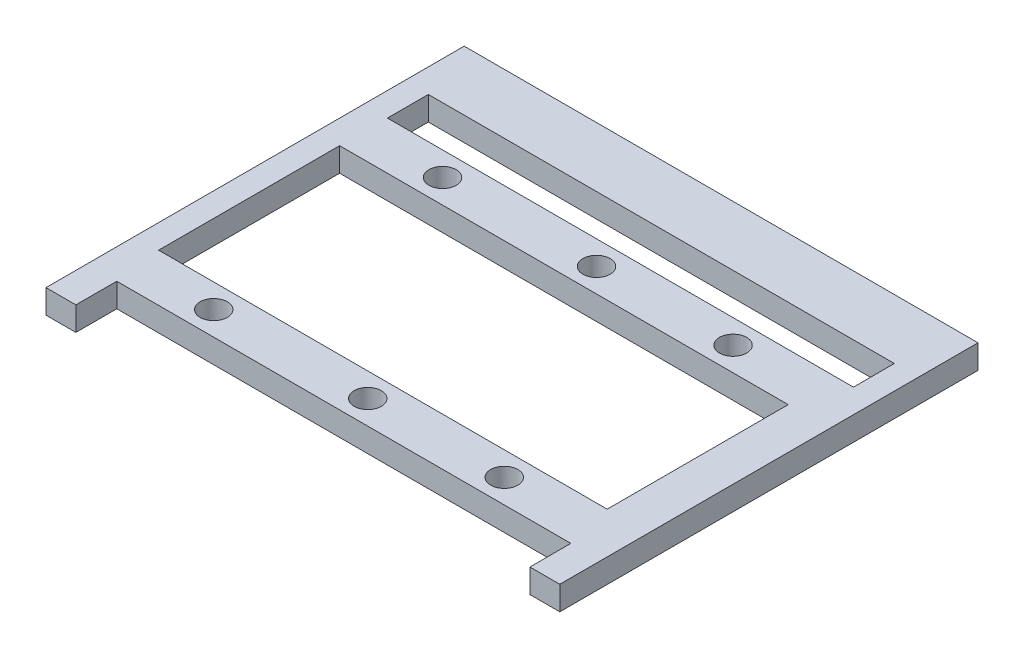
ISO-10303-21;
HEADER;
FILE_DESCRIPTION(('STEP AP214'),'2;1');
FILE_NAME('part.step','',(''),(''),'','','');
FILE_SCHEMA(('AUTOMOTIVE_DESIGN { 1 0 10303 214 1 1 1 1 }'));
ENDSEC;
DATA;
#1=APPLICATION_CONTEXT('core data for automotive mechanical design processes');
#2=APPLICATION_PROTOCOL_DEFINITION('international standard','automotive_design',2000,#1);
#3=PRODUCT_CONTEXT('',#1,'mechanical');
#4=PRODUCT('Part','Part','',(#3));
#5=PRODUCT_RELATED_PRODUCT_CATEGORY('part','',(#4));
#6=PRODUCT_DEFINITION_FORMATION('','',#4);
#7=PRODUCT_DEFINITION_CONTEXT('part definition',#1,'design');
#8=PRODUCT_DEFINITION('design','',#6,#7);
#9=PRODUCT_DEFINITION_SHAPE('','',#8);
#10=(LENGTH_UNIT() NAMED_UNIT(*) SI_UNIT(.MILLI.,.METRE.));
#11=(NAMED_UNIT(*) PLANE_ANGLE_UNIT() SI_UNIT($,.RADIAN.));
#12=(NAMED_UNIT(*) SI_UNIT($,.STERADIAN.) SOLID_ANGLE_UNIT());
#13=UNCERTAINTY_MEASURE_WITH_UNIT(LENGTH_MEASURE(1.E-05),#10,'distance_accuracy_value','');
#14=(GEOMETRIC_REPRESENTATION_CONTEXT(3) GLOBAL_UNCERTAINTY_ASSIGNED_CONTEXT((#13)) GLOBAL_UNIT_ASSIGNED_CONTEXT((#10,
#11,#12)) REPRESENTATION_CONTEXT('',''));
#15=CARTESIAN_POINT('',(0.,0.,0.));
#16=DIRECTION('',(0.,0.,1.));
#17=DIRECTION('',(1.,0.,0.));
#18=AXIS2_PLACEMENT_3D('',#15,#16,#17);
#19=CARTESIAN_POINT('',(0.,4.,0.));
#20=DIRECTION('',(0.,-1.,0.));
#21=DIRECTION('',(0.,0.,-1.));
#22=AXIS2_PLACEMENT_3D('',#19,#20,#21);
#23=PLANE('',#22);
#24=DIRECTION('',(1.,0.,0.));
#25=VECTOR('',#24,1.);
#26=CARTESIAN_POINT('',(43.,4.,-30.));
#27=LINE('',#26,#25);
#28=CARTESIAN_POINT('',(-39.,4.,-30.));
#29=VERTEX_POINT('',#28);
#30=CARTESIAN_POINT('',(39.,4.,-30.));
#31=VERTEX_POINT('',#30);
#32=EDGE_CURVE('E190',#29,#31,#27,.T.);
#33=ORIENTED_EDGE('',*,*,#32,.T.);
#34=DIRECTION('',(0.,0.,1.));
#35=VECTOR('',#34,1.);
#36=CARTESIAN_POINT('',(39.,4.,-30.));
#37=LINE('',#36,#35);
#38=CARTESIAN_POINT('',(39.,4.,-23.15));
#39=VERTEX_POINT('',#38);
#40=EDGE_CURVE('E297',#31,#39,#37,.T.);
#41=ORIENTED_EDGE('',*,*,#40,.T.);
#42=DIRECTION('',(-1.,0.,0.));
#43=VECTOR('',#42,1.);
#44=CARTESIAN_POINT('',(-39.,4.,-23.15));
#45=LINE('',#44,#43);
#46=CARTESIAN_POINT('',(-39.,4.,-23.15));
#47=VERTEX_POINT('',#46);
#48=EDGE_CURVE('E300',#39,#47,#45,.T.);
#49=ORIENTED_EDGE('',*,*,#48,.T.);
#50=DIRECTION('',(0.,0.,-1.));
#51=VECTOR('',#50,1.);
#52=CARTESIAN_POINT('',(-39.,4.,-23.15));
#53=LINE('',#52,#51);
#54=EDGE_CURVE('E303',#47,#29,#53,.T.);
#55=ORIENTED_EDGE('',*,*,#54,.T.);
#56=EDGE_LOOP('',(#33,#41,#49,#55));
#57=FACE_BOUND('',#56,.T.);
#58=CARTESIAN_POINT('',(-25.775,4.,19.15));
#59=DIRECTION('',(0.,1.,0.));
#60=DIRECTION('',(0.,0.,-1.));
#61=AXIS2_PLACEMENT_3D('',#58,#59,#60);
#62=CIRCLE('',#61,2.275);
#63=CARTESIAN_POINT('',(-25.775,4.,16.875));
#64=VERTEX_POINT('',#63);
#65=EDGE_CURVE('E242',#64,#64,#62,.T.);
#66=ORIENTED_EDGE('',*,*,#65,.F.);
#67=EDGE_LOOP('',(#66));
#68=FACE_BOUND('',#67,.T.);
#69=CARTESIAN_POINT('',(0.,4.,19.15));
#70=DIRECTION('',(0.,1.,0.));
#71=DIRECTION('',(0.,0.,-1.));
#72=AXIS2_PLACEMENT_3D('',#69,#70,#71);
#73=CIRCLE('',#72,2.275);
#74=CARTESIAN_POINT('',(0.,4.,16.875));
#75=VERTEX_POINT('',#74);
#76=EDGE_CURVE('E250',#75,#75,#73,.T.);
#77=ORIENTED_EDGE('',*,*,#76,.F.);
#78=EDGE_LOOP('',(#77));
#79=FACE_BOUND('',#78,.T.);
#80=CARTESIAN_POINT('',(22.8542541507849,4.,19.15));
#81=DIRECTION('',(0.,1.,0.));
#82=DIRECTION('',(0.,0.,-1.));
#83=AXIS2_PLACEMENT_3D('',#80,#81,#82);
#84=CIRCLE('',#83,2.275);
#85=CARTESIAN_POINT('',(22.8542541507849,4.,16.875));
#86=VERTEX_POINT('',#85);
#87=EDGE_CURVE('E258',#86,#86,#84,.T.);
#88=ORIENTED_EDGE('',*,*,#87,.F.);
#89=EDGE_LOOP('',(#88));
#90=FACE_BOUND('',#89,.T.);
#91=CARTESIAN_POINT('',(0.,4.,-19.15));
#92=DIRECTION('',(0.,1.,0.));
#93=DIRECTION('',(0.,0.,1.));
#94=AXIS2_PLACEMENT_3D('',#91,#92,#93);
#95=CIRCLE('',#94,2.275);
#96=CARTESIAN_POINT('',(0.,4.,-16.875));
#97=VERTEX_POINT('',#96);
#98=EDGE_CURVE('E266',#97,#97,#95,.T.);
#99=ORIENTED_EDGE('',*,*,#98,.F.);
#100=EDGE_LOOP('',(#99));
#101=FACE_BOUND('',#100,.T.);
#102=CARTESIAN_POINT('',(22.8542541507849,4.,-19.15));
#103=DIRECTION('',(0.,1.,0.));
#104=DIRECTION('',(0.,0.,1.));
#105=AXIS2_PLACEMENT_3D('',#102,#103,#104);
#106=CIRCLE('',#105,2.275);
#107=CARTESIAN_POINT('',(22.8542541507849,4.,-16.875));
#108=VERTEX_POINT('',#107);
#109=EDGE_CURVE('E274',#108,#108,#106,.T.);
#110=ORIENTED_EDGE('',*,*,#109,.F.);
#111=EDGE_LOOP('',(#110));
#112=FACE_BOUND('',#111,.T.);
#113=CARTESIAN_POINT('',(-25.775,4.,-19.15));
#114=DIRECTION('',(0.,1.,0.));
#115=DIRECTION('',(0.,0.,1.));
#116=AXIS2_PLACEMENT_3D('',#113,#114,#115);
#117=CIRCLE('',#116,2.275);
#118=CARTESIAN_POINT('',(-25.775,4.,-16.875));
#119=VERTEX_POINT('',#118);
#120=EDGE_CURVE('E282',#119,#119,#117,.T.);
#121=ORIENTED_EDGE('',*,*,#120,.F.);
#122=EDGE_LOOP('',(#121));
#123=FACE_BOUND('',#122,.T.);
#124=DIRECTION('',(1.,0.,0.));
#125=VECTOR('',#124,1.);
#126=CARTESIAN_POINT('',(38.,4.,30.));
#127=LINE('',#126,#125);
#128=CARTESIAN_POINT('',(38.,4.,30.));
#129=VERTEX_POINT('',#128);
#130=CARTESIAN_POINT('',(43.,4.,30.));
#131=VERTEX_POINT('',#130);
#132=EDGE_CURVE('E289',#129,#131,#127,.T.);
#133=ORIENTED_EDGE('',*,*,#132,.T.);
#134=DIRECTION('',(0.,0.,-1.));
#135=VECTOR('',#134,1.);
#136=CARTESIAN_POINT('',(43.,4.,-30.));
#137=LINE('',#136,#135);
#138=CARTESIAN_POINT('',(43.,4.,-40.));
#139=VERTEX_POINT('',#138);
#140=EDGE_CURVE('E293',#131,#139,#137,.T.);
#141=ORIENTED_EDGE('',*,*,#140,.T.);
#142=DIRECTION('',(1.,0.,0.));
#143=VECTOR('',#142,1.);
#144=CARTESIAN_POINT('',(43.,4.,-40.));
#145=LINE('',#144,#143);
#146=CARTESIAN_POINT('',(-43.,4.,-40.));
#147=VERTEX_POINT('',#146);
#148=EDGE_CURVE('E188',#147,#139,#145,.T.);
#149=ORIENTED_EDGE('',*,*,#148,.F.);
#150=DIRECTION('',(0.,0.,1.));
#151=VECTOR('',#150,1.);
#152=CARTESIAN_POINT('',(-43.,4.,-30.));
#153=LINE('',#152,#151);
#154=CARTESIAN_POINT('',(-43.,4.,30.));
#155=VERTEX_POINT('',#154);
#156=EDGE_CURVE('E307',#147,#155,#153,.T.);
#157=ORIENTED_EDGE('',*,*,#156,.T.);
#158=DIRECTION('',(1.,0.,0.));
#159=VECTOR('',#158,1.);
#160=CARTESIAN_POINT('',(-43.,4.,30.));
#161=LINE('',#160,#159);
#162=CARTESIAN_POINT('',(-38.,4.,30.));
#163=VERTEX_POINT('',#162);
#164=EDGE_CURVE('E310',#155,#163,#161,.T.);
#165=ORIENTED_EDGE('',*,*,#164,.T.);
#166=DIRECTION('',(0.,0.,-1.));
#167=VECTOR('',#166,1.);
#168=CARTESIAN_POINT('',(-38.,4.,30.));
#169=LINE('',#168,#167);
#170=CARTESIAN_POINT('',(-38.,4.,23.15));
#171=VERTEX_POINT('',#170);
#172=EDGE_CURVE('E313',#163,#171,#169,.T.);
#173=ORIENTED_EDGE('',*,*,#172,.T.);
#174=DIRECTION('',(1.,0.,0.));
#175=VECTOR('',#174,1.);
#176=CARTESIAN_POINT('',(-38.,4.,23.15));
#177=LINE('',#176,#175);
#178=CARTESIAN_POINT('',(38.,4.,23.15));
#179=VERTEX_POINT('',#178);
#180=EDGE_CURVE('E316',#171,#179,#177,.T.);
#181=ORIENTED_EDGE('',*,*,#180,.T.);
#182=DIRECTION('',(0.,0.,1.));
#183=VECTOR('',#182,1.);
#184=CARTESIAN_POINT('',(38.,4.,23.15));
#185=LINE('',#184,#183);
#186=EDGE_CURVE('E319',#179,#129,#185,.T.);
#187=ORIENTED_EDGE('',*,*,#186,.T.);
#188=EDGE_LOOP('',(#133,#141,#149,#157,#165,#173,#181,#187));
#189=FACE_BOUND('',#188,.T.);
#190=DIRECTION('',(0.,0.,1.));
#191=VECTOR('',#190,1.);
#192=CARTESIAN_POINT('',(-39.,4.,-15.15));
#193=LINE('',#192,#191);
#194=CARTESIAN_POINT('',(-39.,4.,-15.15));
#195=VERTEX_POINT('',#194);
#196=CARTESIAN_POINT('',(-39.,4.,15.15));
#197=VERTEX_POINT('',#196);
#198=EDGE_CURVE('E204',#195,#197,#193,.T.);
#199=ORIENTED_EDGE('',*,*,#198,.F.);
#200=DIRECTION('',(-1.,0.,0.));
#201=VECTOR('',#200,1.);
#202=CARTESIAN_POINT('',(36.0792541507849,4.,-15.15));
#203=LINE('',#202,#201);
#204=CARTESIAN_POINT('',(36.0792541507849,4.,-15.15));
#205=VERTEX_POINT('',#204);
#206=EDGE_CURVE('E214',#205,#195,#203,.T.);
#207=ORIENTED_EDGE('',*,*,#206,.F.);
#208=DIRECTION('',(0.,0.,-1.));
#209=VECTOR('',#208,1.);
#210=CARTESIAN_POINT('',(36.0792541507849,4.,-15.15));
#211=LINE('',#210,#209);
#212=CARTESIAN_POINT('',(36.0792541507849,4.,15.15));
#213=VERTEX_POINT('',#212);
#214=EDGE_CURVE('E211',#213,#205,#211,.T.);
#215=ORIENTED_EDGE('',*,*,#214,.F.);
#216=DIRECTION('',(1.,0.,0.));
#217=VECTOR('',#216,1.);
#218=CARTESIAN_POINT('',(36.0792541507849,4.,15.15));
#219=LINE('',#218,#217);
#220=EDGE_CURVE('E207',#197,#213,#219,.T.);
#221=ORIENTED_EDGE('',*,*,#220,.F.);
#222=EDGE_LOOP('',(#199,#207,#215,#221));
#223=FACE_BOUND('',#222,.T.);
#224=ADVANCED_FACE('F45',(#57,#68,#79,#90,#101,#112,#123,#189,#223),#23,.F.);
#225=CARTESIAN_POINT('',(0.,0.,0.));
#226=DIRECTION('',(0.,-1.,0.));
#227=DIRECTION('',(0.,0.,-1.));
#228=AXIS2_PLACEMENT_3D('',#225,#226,#227);
#229=PLANE('',#228);
#230=DIRECTION('',(0.,0.,1.));
#231=VECTOR('',#230,1.);
#232=CARTESIAN_POINT('',(39.,0.,-30.));
#233=LINE('',#232,#231);
#234=CARTESIAN_POINT('',(39.,0.,-30.));
#235=VERTEX_POINT('',#234);
#236=CARTESIAN_POINT('',(39.,0.,-23.15));
#237=VERTEX_POINT('',#236);
#238=EDGE_CURVE('E170',#235,#237,#233,.T.);
#239=ORIENTED_EDGE('',*,*,#238,.F.);
#240=DIRECTION('',(-1.,0.,0.));
#241=VECTOR('',#240,1.);
#242=CARTESIAN_POINT('',(43.,0.,-30.));
#243=LINE('',#242,#241);
#244=CARTESIAN_POINT('',(-39.,0.,-30.));
#245=VERTEX_POINT('',#244);
#246=EDGE_CURVE('E194',#235,#245,#243,.T.);
#247=ORIENTED_EDGE('',*,*,#246,.T.);
#248=DIRECTION('',(0.,0.,-1.));
#249=VECTOR('',#248,1.);
#250=CARTESIAN_POINT('',(-39.,0.,-23.15));
#251=LINE('',#250,#249);
#252=CARTESIAN_POINT('',(-39.,0.,-23.15));
#253=VERTEX_POINT('',#252);
#254=EDGE_CURVE('E330',#253,#245,#251,.T.);
#255=ORIENTED_EDGE('',*,*,#254,.F.);
#256=DIRECTION('',(-1.,0.,0.));
#257=VECTOR('',#256,1.);
#258=CARTESIAN_POINT('',(-39.,0.,-23.15));
#259=LINE('',#258,#257);
#260=EDGE_CURVE('E327',#237,#253,#259,.T.);
#261=ORIENTED_EDGE('',*,*,#260,.F.);
#262=EDGE_LOOP('',(#239,#247,#255,#261));
#263=FACE_BOUND('',#262,.T.);
#264=CARTESIAN_POINT('',(0.,0.,19.15));
#265=DIRECTION('',(0.,1.,0.));
#266=DIRECTION('',(0.,0.,-1.));
#267=AXIS2_PLACEMENT_3D('',#264,#265,#266);
#268=CIRCLE('',#267,2.275);
#269=CARTESIAN_POINT('',(0.,0.,16.875));
#270=VERTEX_POINT('',#269);
#271=EDGE_CURVE('E246',#270,#270,#268,.T.);
#272=ORIENTED_EDGE('',*,*,#271,.T.);
#273=EDGE_LOOP('',(#272));
#274=FACE_BOUND('',#273,.T.);
#275=CARTESIAN_POINT('',(0.,0.,-19.15));
#276=DIRECTION('',(0.,1.,0.));
#277=DIRECTION('',(0.,0.,1.));
#278=AXIS2_PLACEMENT_3D('',#275,#276,#277);
#279=CIRCLE('',#278,2.275);
#280=CARTESIAN_POINT('',(0.,0.,-16.875));
#281=VERTEX_POINT('',#280);
#282=EDGE_CURVE('E262',#281,#281,#279,.T.);
#283=ORIENTED_EDGE('',*,*,#282,.T.);
#284=EDGE_LOOP('',(#283));
#285=FACE_BOUND('',#284,.T.);
#286=CARTESIAN_POINT('',(-25.775,0.,-19.15));
#287=DIRECTION('',(0.,1.,0.));
#288=DIRECTION('',(0.,0.,1.));
#289=AXIS2_PLACEMENT_3D('',#286,#287,#288);
#290=CIRCLE('',#289,2.275);
#291=CARTESIAN_POINT('',(-25.775,0.,-16.875));
#292=VERTEX_POINT('',#291);
#293=EDGE_CURVE('E278',#292,#292,#290,.T.);
#294=ORIENTED_EDGE('',*,*,#293,.T.);
#295=EDGE_LOOP('',(#294));
#296=FACE_BOUND('',#295,.T.);
#297=DIRECTION('',(1.,0.,0.));
#298=VECTOR('',#297,1.);
#299=CARTESIAN_POINT('',(38.,0.,30.));
#300=LINE('',#299,#298);
#301=CARTESIAN_POINT('',(38.,0.,30.));
#302=VERTEX_POINT('',#301);
#303=CARTESIAN_POINT('',(43.,0.,30.));
#304=VERTEX_POINT('',#303);
#305=EDGE_CURVE('E171',#302,#304,#300,.T.);
#306=ORIENTED_EDGE('',*,*,#305,.F.);
#307=DIRECTION('',(0.,0.,1.));
#308=VECTOR('',#307,1.);
#309=CARTESIAN_POINT('',(38.,0.,23.15));
#310=LINE('',#309,#308);
#311=CARTESIAN_POINT('',(38.,0.,23.15));
#312=VERTEX_POINT('',#311);
#313=EDGE_CURVE('E294',#312,#302,#310,.T.);
#314=ORIENTED_EDGE('',*,*,#313,.F.);
#315=DIRECTION('',(1.,0.,0.));
#316=VECTOR('',#315,1.);
#317=CARTESIAN_POINT('',(-38.,0.,23.15));
#318=LINE('',#317,#316);
#319=CARTESIAN_POINT('',(-38.,0.,23.15));
#320=VERTEX_POINT('',#319);
#321=EDGE_CURVE('E342',#320,#312,#318,.T.);
#322=ORIENTED_EDGE('',*,*,#321,.F.);
#323=DIRECTION('',(0.,0.,-1.));
#324=VECTOR('',#323,1.);
#325=CARTESIAN_POINT('',(-38.,0.,30.));
#326=LINE('',#325,#324);
#327=CARTESIAN_POINT('',(-38.,0.,30.));
#328=VERTEX_POINT('',#327);
#329=EDGE_CURVE('E339',#328,#320,#326,.T.);
#330=ORIENTED_EDGE('',*,*,#329,.F.);
#331=DIRECTION('',(1.,0.,0.));
#332=VECTOR('',#331,1.);
#333=CARTESIAN_POINT('',(-43.,0.,30.));
#334=LINE('',#333,#332);
#335=CARTESIAN_POINT('',(-43.,0.,30.));
#336=VERTEX_POINT('',#335);
#337=EDGE_CURVE('E336',#336,#328,#334,.T.);
#338=ORIENTED_EDGE('',*,*,#337,.F.);
#339=DIRECTION('',(0.,0.,1.));
#340=VECTOR('',#339,1.);
#341=CARTESIAN_POINT('',(-43.,0.,-30.));
#342=LINE('',#341,#340);
#343=CARTESIAN_POINT('',(-43.,0.,-40.));
#344=VERTEX_POINT('',#343);
#345=EDGE_CURVE('E178',#344,#336,#342,.T.);
#346=ORIENTED_EDGE('',*,*,#345,.F.);
#347=DIRECTION('',(-1.,0.,0.));
#348=VECTOR('',#347,1.);
#349=CARTESIAN_POINT('',(43.,0.,-40.));
#350=LINE('',#349,#348);
#351=CARTESIAN_POINT('',(43.,0.,-40.));
#352=VERTEX_POINT('',#351);
#353=EDGE_CURVE('E174',#352,#344,#350,.T.);
#354=ORIENTED_EDGE('',*,*,#353,.F.);
#355=DIRECTION('',(0.,0.,-1.));
#356=VECTOR('',#355,1.);
#357=CARTESIAN_POINT('',(43.,0.,-30.));
#358=LINE('',#357,#356);
#359=EDGE_CURVE('E160',#304,#352,#358,.T.);
#360=ORIENTED_EDGE('',*,*,#359,.F.);
#361=EDGE_LOOP('',(#306,#314,#322,#330,#338,#346,#354,#360));
#362=FACE_BOUND('',#361,.T.);
#363=CARTESIAN_POINT('',(22.8542541507849,0.,-19.15));
#364=DIRECTION('',(0.,1.,0.));
#365=DIRECTION('',(0.,0.,1.));
#366=AXIS2_PLACEMENT_3D('',#363,#364,#365);
#367=CIRCLE('',#366,2.275);
#368=CARTESIAN_POINT('',(22.8542541507849,0.,-16.875));
#369=VERTEX_POINT('',#368);
#370=EDGE_CURVE('E270',#369,#369,#367,.T.);
#371=ORIENTED_EDGE('',*,*,#370,.T.);
#372=EDGE_LOOP('',(#371));
#373=FACE_BOUND('',#372,.T.);
#374=CARTESIAN_POINT('',(22.8542541507849,0.,19.15));
#375=DIRECTION('',(0.,1.,0.));
#376=DIRECTION('',(0.,0.,-1.));
#377=AXIS2_PLACEMENT_3D('',#374,#375,#376);
#378=CIRCLE('',#377,2.275);
#379=CARTESIAN_POINT('',(22.8542541507849,0.,16.875));
#380=VERTEX_POINT('',#379);
#381=EDGE_CURVE('E254',#380,#380,#378,.T.);
#382=ORIENTED_EDGE('',*,*,#381,.T.);
#383=EDGE_LOOP('',(#382));
#384=FACE_BOUND('',#383,.T.);
#385=CARTESIAN_POINT('',(-25.775,0.,19.15));
#386=DIRECTION('',(0.,1.,0.));
#387=DIRECTION('',(0.,0.,-1.));
#388=AXIS2_PLACEMENT_3D('',#385,#386,#387);
#389=CIRCLE('',#388,2.275);
#390=CARTESIAN_POINT('',(-25.775,0.,16.875));
#391=VERTEX_POINT('',#390);
#392=EDGE_CURVE('E241',#391,#391,#389,.T.);
#393=ORIENTED_EDGE('',*,*,#392,.T.);
#394=EDGE_LOOP('',(#393));
#395=FACE_BOUND('',#394,.T.);
#396=DIRECTION('',(-1.,0.,0.));
#397=VECTOR('',#396,1.);
#398=CARTESIAN_POINT('',(36.0792541507849,0.,-15.15));
#399=LINE('',#398,#397);
#400=CARTESIAN_POINT('',(36.0792541507849,0.,-15.15));
#401=VERTEX_POINT('',#400);
#402=CARTESIAN_POINT('',(-39.,0.,-15.15));
#403=VERTEX_POINT('',#402);
#404=EDGE_CURVE('E208',#401,#403,#399,.T.);
#405=ORIENTED_EDGE('',*,*,#404,.T.);
#406=DIRECTION('',(0.,0.,1.));
#407=VECTOR('',#406,1.);
#408=CARTESIAN_POINT('',(-39.,0.,-15.15));
#409=LINE('',#408,#407);
#410=CARTESIAN_POINT('',(-39.,0.,15.15));
#411=VERTEX_POINT('',#410);
#412=EDGE_CURVE('E69',#403,#411,#409,.T.);
#413=ORIENTED_EDGE('',*,*,#412,.T.);
#414=DIRECTION('',(1.,0.,0.));
#415=VECTOR('',#414,1.);
#416=CARTESIAN_POINT('',(36.0792541507849,0.,15.15));
#417=LINE('',#416,#415);
#418=CARTESIAN_POINT('',(36.0792541507849,0.,15.15));
#419=VERTEX_POINT('',#418);
#420=EDGE_CURVE('E220',#411,#419,#417,.T.);
#421=ORIENTED_EDGE('',*,*,#420,.T.);
#422=DIRECTION('',(0.,0.,-1.));
#423=VECTOR('',#422,1.);
#424=CARTESIAN_POINT('',(36.0792541507849,0.,-15.15));
#425=LINE('',#424,#423);
#426=EDGE_CURVE('E224',#419,#401,#425,.T.);
#427=ORIENTED_EDGE('',*,*,#426,.T.);
#428=EDGE_LOOP('',(#405,#413,#421,#427));
#429=FACE_BOUND('',#428,.T.);
#430=ADVANCED_FACE('F175',(#263,#274,#285,#296,#362,#373,#384,#395,#429),#229,.T.);
#431=CARTESIAN_POINT('',(38.,4.,30.));
#432=DIRECTION('',(0.,0.,-1.));
#433=DIRECTION('',(-1.,0.,0.));
#434=AXIS2_PLACEMENT_3D('',#431,#432,#433);
#435=PLANE('',#434);
#436=ORIENTED_EDGE('',*,*,#305,.T.);
#437=DIRECTION('',(0.,-1.,0.));
#438=VECTOR('',#437,1.);
#439=CARTESIAN_POINT('',(43.,4.,30.));
#440=LINE('',#439,#438);
#441=EDGE_CURVE('E11',#131,#304,#440,.T.);
#442=ORIENTED_EDGE('',*,*,#441,.F.);
#443=ORIENTED_EDGE('',*,*,#132,.F.);
#444=DIRECTION('',(0.,-1.,0.));
#445=VECTOR('',#444,1.);
#446=CARTESIAN_POINT('',(38.,4.,30.));
#447=LINE('',#446,#445);
#448=EDGE_CURVE('E322',#129,#302,#447,.T.);
#449=ORIENTED_EDGE('',*,*,#448,.T.);
#450=EDGE_LOOP('',(#436,#442,#443,#449));
#451=FACE_BOUND('',#450,.T.);
#452=ADVANCED_FACE('F47',(#451),#435,.F.);
#453=CARTESIAN_POINT('',(43.,4.,-30.));
#454=DIRECTION('',(-1.,0.,0.));
#455=DIRECTION('',(0.,0.,1.));
#456=AXIS2_PLACEMENT_3D('',#453,#454,#455);
#457=PLANE('',#456);
#458=ORIENTED_EDGE('',*,*,#359,.T.);
#459=DIRECTION('',(0.,-1.,0.));
#460=VECTOR('',#459,1.);
#461=CARTESIAN_POINT('',(43.,0.,-40.));
#462=LINE('',#461,#460);
#463=EDGE_CURVE('E164',#139,#352,#462,.T.);
#464=ORIENTED_EDGE('',*,*,#463,.F.);
#465=ORIENTED_EDGE('',*,*,#140,.F.);
#466=ORIENTED_EDGE('',*,*,#441,.T.);
#467=EDGE_LOOP('',(#458,#464,#465,#466));
#468=FACE_BOUND('',#467,.T.);
#469=ADVANCED_FACE('F162',(#468),#457,.F.);
#470=CARTESIAN_POINT('',(39.,4.,-30.));
#471=DIRECTION('',(1.,0.,0.));
#472=DIRECTION('',(0.,0.,-1.));
#473=AXIS2_PLACEMENT_3D('',#470,#471,#472);
#474=PLANE('',#473);
#475=ORIENTED_EDGE('',*,*,#238,.T.);
#476=DIRECTION('',(0.,-1.,0.));
#477=VECTOR('',#476,1.);
#478=CARTESIAN_POINT('',(39.,4.,-23.15));
#479=LINE('',#478,#477);
#480=EDGE_CURVE('E373',#39,#237,#479,.T.);
#481=ORIENTED_EDGE('',*,*,#480,.F.);
#482=ORIENTED_EDGE('',*,*,#40,.F.);
#483=DIRECTION('',(0.,-1.,0.));
#484=VECTOR('',#483,1.);
#485=CARTESIAN_POINT('',(39.,4.,-30.));
#486=LINE('',#485,#484);
#487=EDGE_CURVE('E54',#31,#235,#486,.T.);
#488=ORIENTED_EDGE('',*,*,#487,.T.);
#489=EDGE_LOOP('',(#475,#481,#482,#488));
#490=FACE_BOUND('',#489,.T.);
#491=ADVANCED_FACE('F381',(#490),#474,.F.);
#492=CARTESIAN_POINT('',(-39.,4.,-23.15));
#493=DIRECTION('',(0.,0.,1.));
#494=DIRECTION('',(1.,0.,0.));
#495=AXIS2_PLACEMENT_3D('',#492,#493,#494);
#496=PLANE('',#495);
#497=ORIENTED_EDGE('',*,*,#260,.T.);
#498=DIRECTION('',(0.,-1.,0.));
#499=VECTOR('',#498,1.);
#500=CARTESIAN_POINT('',(-39.,4.,-23.15));
#501=LINE('',#500,#499);
#502=EDGE_CURVE('E369',#47,#253,#501,.T.);
#503=ORIENTED_EDGE('',*,*,#502,.F.);
#504=ORIENTED_EDGE('',*,*,#48,.F.);
#505=ORIENTED_EDGE('',*,*,#480,.T.);
#506=EDGE_LOOP('',(#497,#503,#504,#505));
#507=FACE_BOUND('',#506,.T.);
#508=ADVANCED_FACE('F390',(#507),#496,.F.);
#509=CARTESIAN_POINT('',(-39.,4.,-23.15));
#510=DIRECTION('',(-1.,0.,0.));
#511=DIRECTION('',(0.,0.,1.));
#512=AXIS2_PLACEMENT_3D('',#509,#510,#511);
#513=PLANE('',#512);
#514=ORIENTED_EDGE('',*,*,#254,.T.);
#515=DIRECTION('',(0.,-1.,0.));
#516=VECTOR('',#515,1.);
#517=CARTESIAN_POINT('',(-39.,4.,-30.));
#518=LINE('',#517,#516);
#519=EDGE_CURVE('E366',#29,#245,#518,.T.);
#520=ORIENTED_EDGE('',*,*,#519,.F.);
#521=ORIENTED_EDGE('',*,*,#54,.F.);
#522=ORIENTED_EDGE('',*,*,#502,.T.);
#523=EDGE_LOOP('',(#514,#520,#521,#522));
#524=FACE_BOUND('',#523,.T.);
#525=ADVANCED_FACE('F394',(#524),#513,.F.);
#526=CARTESIAN_POINT('',(-43.,4.,-30.));
#527=DIRECTION('',(1.,0.,0.));
#528=DIRECTION('',(0.,0.,-1.));
#529=AXIS2_PLACEMENT_3D('',#526,#527,#528);
#530=PLANE('',#529);
#531=ORIENTED_EDGE('',*,*,#345,.T.);
#532=DIRECTION('',(0.,-1.,0.));
#533=VECTOR('',#532,1.);
#534=CARTESIAN_POINT('',(-43.,4.,30.));
#535=LINE('',#534,#533);
#536=EDGE_CURVE('E362',#155,#336,#535,.T.);
#537=ORIENTED_EDGE('',*,*,#536,.F.);
#538=ORIENTED_EDGE('',*,*,#156,.F.);
#539=DIRECTION('',(0.,1.,0.));
#540=VECTOR('',#539,1.);
#541=CARTESIAN_POINT('',(-43.,0.,-40.));
#542=LINE('',#541,#540);
#543=EDGE_CURVE('E183',#344,#147,#542,.T.);
#544=ORIENTED_EDGE('',*,*,#543,.F.);
#545=EDGE_LOOP('',(#531,#537,#538,#544));
#546=FACE_BOUND('',#545,.T.);
#547=ADVANCED_FACE('F435',(#546),#530,.F.);
#548=CARTESIAN_POINT('',(-43.,4.,30.));
#549=DIRECTION('',(0.,0.,-1.));
#550=DIRECTION('',(-1.,0.,0.));
#551=AXIS2_PLACEMENT_3D('',#548,#549,#550);
#552=PLANE('',#551);
#553=ORIENTED_EDGE('',*,*,#337,.T.);
#554=DIRECTION('',(0.,-1.,0.));
#555=VECTOR('',#554,1.);
#556=CARTESIAN_POINT('',(-38.,4.,30.));
#557=LINE('',#556,#555);
#558=EDGE_CURVE('E358',#163,#328,#557,.T.);
#559=ORIENTED_EDGE('',*,*,#558,.F.);
#560=ORIENTED_EDGE('',*,*,#164,.F.);
#561=ORIENTED_EDGE('',*,*,#536,.T.);
#562=EDGE_LOOP('',(#553,#559,#560,#561));
#563=FACE_BOUND('',#562,.T.);
#564=ADVANCED_FACE('F431',(#563),#552,.F.);
#565=CARTESIAN_POINT('',(-38.,4.,30.));
#566=DIRECTION('',(-1.,0.,0.));
#567=DIRECTION('',(0.,0.,1.));
#568=AXIS2_PLACEMENT_3D('',#565,#566,#567);
#569=PLANE('',#568);
#570=ORIENTED_EDGE('',*,*,#329,.T.);
#571=DIRECTION('',(0.,-1.,0.));
#572=VECTOR('',#571,1.);
#573=CARTESIAN_POINT('',(-38.,4.,23.15));
#574=LINE('',#573,#572);
#575=EDGE_CURVE('E354',#171,#320,#574,.T.);
#576=ORIENTED_EDGE('',*,*,#575,.F.);
#577=ORIENTED_EDGE('',*,*,#172,.F.);
#578=ORIENTED_EDGE('',*,*,#558,.T.);
#579=EDGE_LOOP('',(#570,#576,#577,#578));
#580=FACE_BOUND('',#579,.T.);
#581=ADVANCED_FACE('F427',(#580),#569,.F.);
#582=CARTESIAN_POINT('',(-38.,4.,23.15));
#583=DIRECTION('',(0.,0.,-1.));
#584=DIRECTION('',(-1.,0.,0.));
#585=AXIS2_PLACEMENT_3D('',#582,#583,#584);
#586=PLANE('',#585);
#587=ORIENTED_EDGE('',*,*,#321,.T.);
#588=DIRECTION('',(0.,-1.,0.));
#589=VECTOR('',#588,1.);
#590=CARTESIAN_POINT('',(38.,4.,23.15));
#591=LINE('',#590,#589);
#592=EDGE_CURVE('E350',#179,#312,#591,.T.);
#593=ORIENTED_EDGE('',*,*,#592,.F.);
#594=ORIENTED_EDGE('',*,*,#180,.F.);
#595=ORIENTED_EDGE('',*,*,#575,.T.);
#596=EDGE_LOOP('',(#587,#593,#594,#595));
#597=FACE_BOUND('',#596,.T.);
#598=ADVANCED_FACE('F423',(#597),#586,.F.);
#599=CARTESIAN_POINT('',(38.,4.,23.15));
#600=DIRECTION('',(1.,0.,0.));
#601=DIRECTION('',(0.,0.,-1.));
#602=AXIS2_PLACEMENT_3D('',#599,#600,#601);
#603=PLANE('',#602);
#604=ORIENTED_EDGE('',*,*,#313,.T.);
#605=ORIENTED_EDGE('',*,*,#448,.F.);
#606=ORIENTED_EDGE('',*,*,#186,.F.);
#607=ORIENTED_EDGE('',*,*,#592,.T.);
#608=EDGE_LOOP('',(#604,#605,#606,#607));
#609=FACE_BOUND('',#608,.T.);
#610=ADVANCED_FACE('F420',(#609),#603,.F.);
#611=CARTESIAN_POINT('',(-25.775,4.,-19.15));
#612=DIRECTION('',(0.,-1.,0.));
#613=DIRECTION('',(0.,0.,-1.));
#614=AXIS2_PLACEMENT_3D('',#611,#612,#613);
#615=CYLINDRICAL_SURFACE('',#614,2.275);
#616=ORIENTED_EDGE('',*,*,#120,.T.);
#617=EDGE_LOOP('',(#616));
#618=FACE_BOUND('',#617,.T.);
#619=ORIENTED_EDGE('',*,*,#293,.F.);
#620=EDGE_LOOP('',(#619));
#621=FACE_BOUND('',#620,.T.);
#622=ADVANCED_FACE('F417',(#618,#621),#615,.F.);
#623=CARTESIAN_POINT('',(22.8542541507849,4.,-19.15));
#624=DIRECTION('',(0.,-1.,0.));
#625=DIRECTION('',(0.,0.,-1.));
#626=AXIS2_PLACEMENT_3D('',#623,#624,#625);
#627=CYLINDRICAL_SURFACE('',#626,2.275);
#628=ORIENTED_EDGE('',*,*,#109,.T.);
#629=EDGE_LOOP('',(#628));
#630=FACE_BOUND('',#629,.T.);
#631=ORIENTED_EDGE('',*,*,#370,.F.);
#632=EDGE_LOOP('',(#631));
#633=FACE_BOUND('',#632,.T.);
#634=ADVANCED_FACE('F501',(#630,#633),#627,.F.);
#635=CARTESIAN_POINT('',(0.,4.,-19.15));
#636=DIRECTION('',(0.,-1.,0.));
#637=DIRECTION('',(0.,0.,-1.));
#638=AXIS2_PLACEMENT_3D('',#635,#636,#637);
#639=CYLINDRICAL_SURFACE('',#638,2.275);
#640=ORIENTED_EDGE('',*,*,#98,.T.);
#641=EDGE_LOOP('',(#640));
#642=FACE_BOUND('',#641,.T.);
#643=ORIENTED_EDGE('',*,*,#282,.F.);
#644=EDGE_LOOP('',(#643));
#645=FACE_BOUND('',#644,.T.);
#646=ADVANCED_FACE('F498',(#642,#645),#639,.F.);
#647=CARTESIAN_POINT('',(22.8542541507849,4.,19.15));
#648=DIRECTION('',(0.,-1.,0.));
#649=DIRECTION('',(0.,0.,-1.));
#650=AXIS2_PLACEMENT_3D('',#647,#648,#649);
#651=CYLINDRICAL_SURFACE('',#650,2.275);
#652=ORIENTED_EDGE('',*,*,#87,.T.);
#653=EDGE_LOOP('',(#652));
#654=FACE_BOUND('',#653,.T.);
#655=ORIENTED_EDGE('',*,*,#381,.F.);
#656=EDGE_LOOP('',(#655));
#657=FACE_BOUND('',#656,.T.);
#658=ADVANCED_FACE('F494',(#654,#657),#651,.F.);
#659=CARTESIAN_POINT('',(0.,4.,19.15));
#660=DIRECTION('',(0.,-1.,0.));
#661=DIRECTION('',(0.,0.,-1.));
#662=AXIS2_PLACEMENT_3D('',#659,#660,#661);
#663=CYLINDRICAL_SURFACE('',#662,2.275);
#664=ORIENTED_EDGE('',*,*,#76,.T.);
#665=EDGE_LOOP('',(#664));
#666=FACE_BOUND('',#665,.T.);
#667=ORIENTED_EDGE('',*,*,#271,.F.);
#668=EDGE_LOOP('',(#667));
#669=FACE_BOUND('',#668,.T.);
#670=ADVANCED_FACE('F490',(#666,#669),#663,.F.);
#671=CARTESIAN_POINT('',(-25.775,4.,19.15));
#672=DIRECTION('',(0.,-1.,0.));
#673=DIRECTION('',(0.,0.,-1.));
#674=AXIS2_PLACEMENT_3D('',#671,#672,#673);
#675=CYLINDRICAL_SURFACE('',#674,2.275);
#676=ORIENTED_EDGE('',*,*,#65,.T.);
#677=EDGE_LOOP('',(#676));
#678=FACE_BOUND('',#677,.T.);
#679=ORIENTED_EDGE('',*,*,#392,.F.);
#680=EDGE_LOOP('',(#679));
#681=FACE_BOUND('',#680,.T.);
#682=ADVANCED_FACE('F487',(#678,#681),#675,.F.);
#683=CARTESIAN_POINT('',(-39.,4.,-15.15));
#684=DIRECTION('',(1.,0.,0.));
#685=DIRECTION('',(0.,0.,-1.));
#686=AXIS2_PLACEMENT_3D('',#683,#684,#685);
#687=PLANE('',#686);
#688=ORIENTED_EDGE('',*,*,#412,.F.);
#689=DIRECTION('',(0.,-1.,0.));
#690=VECTOR('',#689,1.);
#691=CARTESIAN_POINT('',(-39.,4.,-15.15));
#692=LINE('',#691,#690);
#693=EDGE_CURVE('E217',#195,#403,#692,.T.);
#694=ORIENTED_EDGE('',*,*,#693,.F.);
#695=ORIENTED_EDGE('',*,*,#198,.T.);
#696=DIRECTION('',(0.,-1.,0.));
#697=VECTOR('',#696,1.);
#698=CARTESIAN_POINT('',(-39.,4.,15.15));
#699=LINE('',#698,#697);
#700=EDGE_CURVE('E238',#197,#411,#699,.T.);
#701=ORIENTED_EDGE('',*,*,#700,.T.);
#702=EDGE_LOOP('',(#688,#694,#695,#701));
#703=FACE_BOUND('',#702,.T.);
#704=ADVANCED_FACE('F471',(#703),#687,.T.);
#705=CARTESIAN_POINT('',(36.0792541507849,4.,15.15));
#706=DIRECTION('',(0.,0.,-1.));
#707=DIRECTION('',(-1.,0.,0.));
#708=AXIS2_PLACEMENT_3D('',#705,#706,#707);
#709=PLANE('',#708);
#710=ORIENTED_EDGE('',*,*,#420,.F.);
#711=ORIENTED_EDGE('',*,*,#700,.F.);
#712=ORIENTED_EDGE('',*,*,#220,.T.);
#713=DIRECTION('',(0.,-1.,0.));
#714=VECTOR('',#713,1.);
#715=CARTESIAN_POINT('',(36.0792541507849,4.,15.15));
#716=LINE('',#715,#714);
#717=EDGE_CURVE('E235',#213,#419,#716,.T.);
#718=ORIENTED_EDGE('',*,*,#717,.T.);
#719=EDGE_LOOP('',(#710,#711,#712,#718));
#720=FACE_BOUND('',#719,.T.);
#721=ADVANCED_FACE('F473',(#720),#709,.T.);
#722=CARTESIAN_POINT('',(36.0792541507849,4.,-15.15));
#723=DIRECTION('',(-1.,0.,0.));
#724=DIRECTION('',(0.,0.,1.));
#725=AXIS2_PLACEMENT_3D('',#722,#723,#724);
#726=PLANE('',#725);
#727=ORIENTED_EDGE('',*,*,#426,.F.);
#728=ORIENTED_EDGE('',*,*,#717,.F.);
#729=ORIENTED_EDGE('',*,*,#214,.T.);
#730=DIRECTION('',(0.,-1.,0.));
#731=VECTOR('',#730,1.);
#732=CARTESIAN_POINT('',(36.0792541507849,4.,-15.15));
#733=LINE('',#732,#731);
#734=EDGE_CURVE('E61',#205,#401,#733,.T.);
#735=ORIENTED_EDGE('',*,*,#734,.T.);
#736=EDGE_LOOP('',(#727,#728,#729,#735));
#737=FACE_BOUND('',#736,.T.);
#738=ADVANCED_FACE('F408',(#737),#726,.T.);
#739=CARTESIAN_POINT('',(36.0792541507849,4.,-15.15));
#740=DIRECTION('',(0.,0.,1.));
#741=DIRECTION('',(1.,0.,0.));
#742=AXIS2_PLACEMENT_3D('',#739,#740,#741);
#743=PLANE('',#742);
#744=ORIENTED_EDGE('',*,*,#404,.F.);
#745=ORIENTED_EDGE('',*,*,#734,.F.);
#746=ORIENTED_EDGE('',*,*,#206,.T.);
#747=ORIENTED_EDGE('',*,*,#693,.T.);
#748=EDGE_LOOP('',(#744,#745,#746,#747));
#749=FACE_BOUND('',#748,.T.);
#750=ADVANCED_FACE('F400',(#749),#743,.T.);
#751=CARTESIAN_POINT('',(0.,0.,-30.));
#752=DIRECTION('',(0.,0.,1.));
#753=DIRECTION('',(1.,0.,0.));
#754=AXIS2_PLACEMENT_3D('',#751,#752,#753);
#755=PLANE('',#754);
#756=ORIENTED_EDGE('',*,*,#487,.F.);
#757=ORIENTED_EDGE('',*,*,#32,.F.);
#758=ORIENTED_EDGE('',*,*,#519,.T.);
#759=ORIENTED_EDGE('',*,*,#246,.F.);
#760=EDGE_LOOP('',(#756,#757,#758,#759));
#761=FACE_BOUND('',#760,.T.);
#762=ADVANCED_FACE('F398',(#761),#755,.T.);
#763=CARTESIAN_POINT('',(0.,0.,-40.));
#764=DIRECTION('',(0.,0.,1.));
#765=DIRECTION('',(1.,0.,0.));
#766=AXIS2_PLACEMENT_3D('',#763,#764,#765);
#767=PLANE('',#766);
#768=ORIENTED_EDGE('',*,*,#463,.T.);
#769=ORIENTED_EDGE('',*,*,#353,.T.);
#770=ORIENTED_EDGE('',*,*,#543,.T.);
#771=ORIENTED_EDGE('',*,*,#148,.T.);
#772=EDGE_LOOP('',(#768,#769,#770,#771));
#773=FACE_BOUND('',#772,.T.);
#774=ADVANCED_FACE('F186',(#773),#767,.F.);
#775=CLOSED_SHELL('',(#224,#430,#452,#469,#491,#508,#525,#547,#564,#581,#598,#610,#622,#634,
#646,#658,#670,#682,#704,#721,#738,#750,#762,#774));
#776=MANIFOLD_SOLID_BREP('B2',#775);
#777=ADVANCED_BREP_SHAPE_REPRESENTATION('',(#18,#776),#14);
#778=SHAPE_DEFINITION_REPRESENTATION(#9,#777);
ENDSEC;
END-ISO-10303-21;
